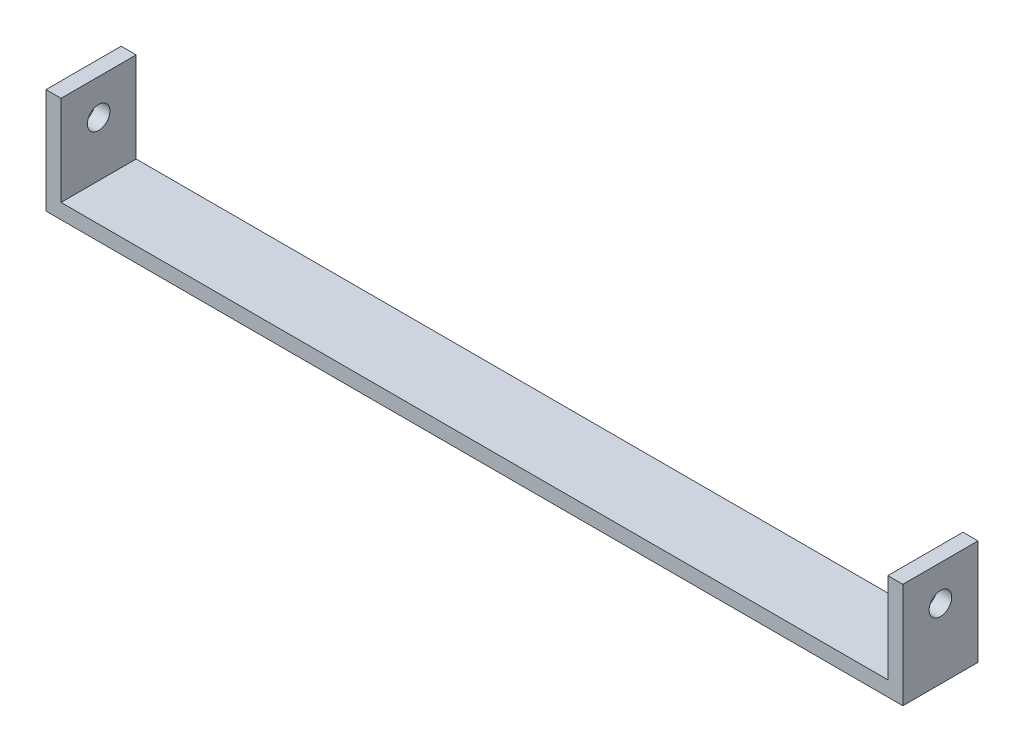
ISO-10303-21;
HEADER;
FILE_DESCRIPTION(('STEP AP214'),'2;1');
FILE_NAME('part.step','',(''),(''),'','','');
FILE_SCHEMA(('AUTOMOTIVE_DESIGN { 1 0 10303 214 1 1 1 1 }'));
ENDSEC;
DATA;
#1=APPLICATION_CONTEXT('core data for automotive mechanical design processes');
#2=APPLICATION_PROTOCOL_DEFINITION('international standard','automotive_design',2000,#1);
#3=PRODUCT_CONTEXT('',#1,'mechanical');
#4=PRODUCT('Part','Part','',(#3));
#5=PRODUCT_RELATED_PRODUCT_CATEGORY('part','',(#4));
#6=PRODUCT_DEFINITION_FORMATION('','',#4);
#7=PRODUCT_DEFINITION_CONTEXT('part definition',#1,'design');
#8=PRODUCT_DEFINITION('design','',#6,#7);
#9=PRODUCT_DEFINITION_SHAPE('','',#8);
#10=(LENGTH_UNIT() NAMED_UNIT(*) SI_UNIT(.MILLI.,.METRE.));
#11=(NAMED_UNIT(*) PLANE_ANGLE_UNIT() SI_UNIT($,.RADIAN.));
#12=(NAMED_UNIT(*) SI_UNIT($,.STERADIAN.) SOLID_ANGLE_UNIT());
#13=UNCERTAINTY_MEASURE_WITH_UNIT(LENGTH_MEASURE(1.E-05),#10,'distance_accuracy_value','');
#14=(GEOMETRIC_REPRESENTATION_CONTEXT(3) GLOBAL_UNCERTAINTY_ASSIGNED_CONTEXT((#13)) GLOBAL_UNIT_ASSIGNED_CONTEXT((#10,
#11,#12)) REPRESENTATION_CONTEXT('',''));
#15=CARTESIAN_POINT('',(0.,0.,0.));
#16=DIRECTION('',(0.,0.,1.));
#17=DIRECTION('',(1.,0.,0.));
#18=AXIS2_PLACEMENT_3D('',#15,#16,#17);
#19=CARTESIAN_POINT('',(-57.,0.,10.));
#20=DIRECTION('',(1.,0.,0.));
#21=DIRECTION('',(0.,1.,0.));
#22=AXIS2_PLACEMENT_3D('',#19,#20,#21);
#23=PLANE('',#22);
#24=CARTESIAN_POINT('',(-57.,9.28489764823584,5.));
#25=DIRECTION('',(1.,0.,0.));
#26=DIRECTION('',(0.,1.,0.));
#27=AXIS2_PLACEMENT_3D('',#24,#25,#26);
#28=CIRCLE('',#27,1.5);
#29=CARTESIAN_POINT('',(-57.,9.28489764823584,6.5));
#30=VERTEX_POINT('',#29);
#31=EDGE_CURVE('E134',#30,#30,#28,.T.);
#32=ORIENTED_EDGE('',*,*,#31,.T.);
#33=EDGE_LOOP('',(#32));
#34=FACE_BOUND('',#33,.T.);
#35=DIRECTION('',(0.,-1.,0.));
#36=VECTOR('',#35,1.);
#37=CARTESIAN_POINT('',(-57.,0.,0.));
#38=LINE('',#37,#36);
#39=CARTESIAN_POINT('',(-57.,13.9999999999999,0.));
#40=VERTEX_POINT('',#39);
#41=CARTESIAN_POINT('',(-57.,0.,0.));
#42=VERTEX_POINT('',#41);
#43=EDGE_CURVE('E130',#40,#42,#38,.T.);
#44=ORIENTED_EDGE('',*,*,#43,.T.);
#45=DIRECTION('',(0.,0.,-1.));
#46=VECTOR('',#45,1.);
#47=CARTESIAN_POINT('',(-57.,0.,10.));
#48=LINE('',#47,#46);
#49=CARTESIAN_POINT('',(-57.,0.,10.));
#50=VERTEX_POINT('',#49);
#51=EDGE_CURVE('E11',#50,#42,#48,.T.);
#52=ORIENTED_EDGE('',*,*,#51,.F.);
#53=DIRECTION('',(0.,-1.,0.));
#54=VECTOR('',#53,1.);
#55=CARTESIAN_POINT('',(-57.,0.,10.));
#56=LINE('',#55,#54);
#57=CARTESIAN_POINT('',(-57.,13.9999999999999,10.));
#58=VERTEX_POINT('',#57);
#59=EDGE_CURVE('E145',#58,#50,#56,.T.);
#60=ORIENTED_EDGE('',*,*,#59,.F.);
#61=DIRECTION('',(0.,0.,-1.));
#62=VECTOR('',#61,1.);
#63=CARTESIAN_POINT('',(-57.,13.9999999999999,10.));
#64=LINE('',#63,#62);
#65=EDGE_CURVE('E126',#58,#40,#64,.T.);
#66=ORIENTED_EDGE('',*,*,#65,.T.);
#67=EDGE_LOOP('',(#44,#52,#60,#66));
#68=FACE_BOUND('',#67,.T.);
#69=ADVANCED_FACE('F33',(#34,#68),#23,.F.);
#70=CARTESIAN_POINT('',(57.,0.,10.));
#71=DIRECTION('',(0.,1.,0.));
#72=DIRECTION('',(0.,0.,1.));
#73=AXIS2_PLACEMENT_3D('',#70,#71,#72);
#74=PLANE('',#73);
#75=DIRECTION('',(1.,0.,0.));
#76=VECTOR('',#75,1.);
#77=CARTESIAN_POINT('',(57.,0.,0.));
#78=LINE('',#77,#76);
#79=CARTESIAN_POINT('',(57.,0.,0.));
#80=VERTEX_POINT('',#79);
#81=EDGE_CURVE('E133',#42,#80,#78,.T.);
#82=ORIENTED_EDGE('',*,*,#81,.T.);
#83=DIRECTION('',(0.,0.,-1.));
#84=VECTOR('',#83,1.);
#85=CARTESIAN_POINT('',(57.,0.,10.));
#86=LINE('',#85,#84);
#87=CARTESIAN_POINT('',(57.,0.,10.));
#88=VERTEX_POINT('',#87);
#89=EDGE_CURVE('E42',#88,#80,#86,.T.);
#90=ORIENTED_EDGE('',*,*,#89,.F.);
#91=DIRECTION('',(1.,0.,0.));
#92=VECTOR('',#91,1.);
#93=CARTESIAN_POINT('',(57.,0.,10.));
#94=LINE('',#93,#92);
#95=EDGE_CURVE('E93',#50,#88,#94,.T.);
#96=ORIENTED_EDGE('',*,*,#95,.F.);
#97=ORIENTED_EDGE('',*,*,#51,.T.);
#98=EDGE_LOOP('',(#82,#90,#96,#97));
#99=FACE_BOUND('',#98,.T.);
#100=ADVANCED_FACE('F201',(#99),#74,.F.);
#101=CARTESIAN_POINT('',(57.,0.,10.));
#102=DIRECTION('',(-1.,0.,0.));
#103=DIRECTION('',(0.,-1.,0.));
#104=AXIS2_PLACEMENT_3D('',#101,#102,#103);
#105=PLANE('',#104);
#106=CARTESIAN_POINT('',(57.,9.28489764823584,5.));
#107=DIRECTION('',(-1.,0.,0.));
#108=DIRECTION('',(0.,0.,1.));
#109=AXIS2_PLACEMENT_3D('',#106,#107,#108);
#110=CIRCLE('',#109,1.5);
#111=CARTESIAN_POINT('',(57.,9.28489764823584,6.5));
#112=VERTEX_POINT('',#111);
#113=EDGE_CURVE('E184',#112,#112,#110,.T.);
#114=ORIENTED_EDGE('',*,*,#113,.T.);
#115=EDGE_LOOP('',(#114));
#116=FACE_BOUND('',#115,.T.);
#117=DIRECTION('',(0.,1.,0.));
#118=VECTOR('',#117,1.);
#119=CARTESIAN_POINT('',(57.,0.,0.));
#120=LINE('',#119,#118);
#121=CARTESIAN_POINT('',(57.,13.9999999999999,0.));
#122=VERTEX_POINT('',#121);
#123=EDGE_CURVE('E136',#80,#122,#120,.T.);
#124=ORIENTED_EDGE('',*,*,#123,.T.);
#125=DIRECTION('',(0.,0.,-1.));
#126=VECTOR('',#125,1.);
#127=CARTESIAN_POINT('',(57.,13.9999999999999,10.));
#128=LINE('',#127,#126);
#129=CARTESIAN_POINT('',(57.,13.9999999999999,10.));
#130=VERTEX_POINT('',#129);
#131=EDGE_CURVE('E152',#130,#122,#128,.T.);
#132=ORIENTED_EDGE('',*,*,#131,.F.);
#133=DIRECTION('',(0.,1.,0.));
#134=VECTOR('',#133,1.);
#135=CARTESIAN_POINT('',(57.,0.,10.));
#136=LINE('',#135,#134);
#137=EDGE_CURVE('E161',#88,#130,#136,.T.);
#138=ORIENTED_EDGE('',*,*,#137,.F.);
#139=ORIENTED_EDGE('',*,*,#89,.T.);
#140=EDGE_LOOP('',(#124,#132,#138,#139));
#141=FACE_BOUND('',#140,.T.);
#142=ADVANCED_FACE('F159',(#116,#141),#105,.F.);
#143=CARTESIAN_POINT('',(57.,13.9999999999999,10.));
#144=DIRECTION('',(0.,-1.,0.));
#145=DIRECTION('',(1.,0.,0.));
#146=AXIS2_PLACEMENT_3D('',#143,#144,#145);
#147=PLANE('',#146);
#148=DIRECTION('',(-1.,0.,0.));
#149=VECTOR('',#148,1.);
#150=CARTESIAN_POINT('',(57.,13.9999999999999,0.));
#151=LINE('',#150,#149);
#152=CARTESIAN_POINT('',(55.,13.9999999999999,0.));
#153=VERTEX_POINT('',#152);
#154=EDGE_CURVE('E138',#122,#153,#151,.T.);
#155=ORIENTED_EDGE('',*,*,#154,.T.);
#156=DIRECTION('',(0.,0.,-1.));
#157=VECTOR('',#156,1.);
#158=CARTESIAN_POINT('',(55.,13.9999999999999,10.));
#159=LINE('',#158,#157);
#160=CARTESIAN_POINT('',(55.,13.9999999999999,10.));
#161=VERTEX_POINT('',#160);
#162=EDGE_CURVE('E149',#161,#153,#159,.T.);
#163=ORIENTED_EDGE('',*,*,#162,.F.);
#164=DIRECTION('',(-1.,0.,0.));
#165=VECTOR('',#164,1.);
#166=CARTESIAN_POINT('',(57.,13.9999999999999,10.));
#167=LINE('',#166,#165);
#168=EDGE_CURVE('E173',#130,#161,#167,.T.);
#169=ORIENTED_EDGE('',*,*,#168,.F.);
#170=ORIENTED_EDGE('',*,*,#131,.T.);
#171=EDGE_LOOP('',(#155,#163,#169,#170));
#172=FACE_BOUND('',#171,.T.);
#173=ADVANCED_FACE('F169',(#172),#147,.F.);
#174=CARTESIAN_POINT('',(55.,13.9999999999999,10.));
#175=DIRECTION('',(1.,0.,0.));
#176=DIRECTION('',(0.,0.,-1.));
#177=AXIS2_PLACEMENT_3D('',#174,#175,#176);
#178=PLANE('',#177);
#179=CARTESIAN_POINT('',(55.,9.28489764823584,5.));
#180=DIRECTION('',(1.,0.,0.));
#181=DIRECTION('',(0.,0.,-1.));
#182=AXIS2_PLACEMENT_3D('',#179,#180,#181);
#183=CIRCLE('',#182,1.5);
#184=CARTESIAN_POINT('',(55.,9.28489764823584,6.5));
#185=VERTEX_POINT('',#184);
#186=EDGE_CURVE('E181',#185,#185,#183,.T.);
#187=ORIENTED_EDGE('',*,*,#186,.T.);
#188=EDGE_LOOP('',(#187));
#189=FACE_BOUND('',#188,.T.);
#190=DIRECTION('',(0.,-1.,0.));
#191=VECTOR('',#190,1.);
#192=CARTESIAN_POINT('',(55.,13.9999999999999,0.));
#193=LINE('',#192,#191);
#194=CARTESIAN_POINT('',(55.,1.99999999999998,0.));
#195=VERTEX_POINT('',#194);
#196=EDGE_CURVE('E140',#153,#195,#193,.T.);
#197=ORIENTED_EDGE('',*,*,#196,.T.);
#198=DIRECTION('',(0.,0.,-1.));
#199=VECTOR('',#198,1.);
#200=CARTESIAN_POINT('',(55.,1.99999999999998,10.));
#201=LINE('',#200,#199);
#202=CARTESIAN_POINT('',(55.,1.99999999999998,10.));
#203=VERTEX_POINT('',#202);
#204=EDGE_CURVE('E121',#203,#195,#201,.T.);
#205=ORIENTED_EDGE('',*,*,#204,.F.);
#206=DIRECTION('',(0.,-1.,0.));
#207=VECTOR('',#206,1.);
#208=CARTESIAN_POINT('',(55.,13.9999999999999,10.));
#209=LINE('',#208,#207);
#210=EDGE_CURVE('E112',#161,#203,#209,.T.);
#211=ORIENTED_EDGE('',*,*,#210,.F.);
#212=ORIENTED_EDGE('',*,*,#162,.T.);
#213=EDGE_LOOP('',(#197,#205,#211,#212));
#214=FACE_BOUND('',#213,.T.);
#215=ADVANCED_FACE('F172',(#189,#214),#178,.F.);
#216=CARTESIAN_POINT('',(-55.,1.99999999999998,10.));
#217=DIRECTION('',(0.,-1.,0.));
#218=DIRECTION('',(0.,0.,-1.));
#219=AXIS2_PLACEMENT_3D('',#216,#217,#218);
#220=PLANE('',#219);
#221=DIRECTION('',(-1.,0.,0.));
#222=VECTOR('',#221,1.);
#223=CARTESIAN_POINT('',(-55.,1.99999999999998,0.));
#224=LINE('',#223,#222);
#225=CARTESIAN_POINT('',(-55.,1.99999999999998,0.));
#226=VERTEX_POINT('',#225);
#227=EDGE_CURVE('E120',#195,#226,#224,.T.);
#228=ORIENTED_EDGE('',*,*,#227,.T.);
#229=DIRECTION('',(0.,0.,-1.));
#230=VECTOR('',#229,1.);
#231=CARTESIAN_POINT('',(-55.,1.99999999999998,10.));
#232=LINE('',#231,#230);
#233=CARTESIAN_POINT('',(-55.,1.99999999999998,10.));
#234=VERTEX_POINT('',#233);
#235=EDGE_CURVE('E117',#234,#226,#232,.T.);
#236=ORIENTED_EDGE('',*,*,#235,.F.);
#237=DIRECTION('',(-1.,0.,0.));
#238=VECTOR('',#237,1.);
#239=CARTESIAN_POINT('',(-55.,1.99999999999998,10.));
#240=LINE('',#239,#238);
#241=EDGE_CURVE('E106',#203,#234,#240,.T.);
#242=ORIENTED_EDGE('',*,*,#241,.F.);
#243=ORIENTED_EDGE('',*,*,#204,.T.);
#244=EDGE_LOOP('',(#228,#236,#242,#243));
#245=FACE_BOUND('',#244,.T.);
#246=ADVANCED_FACE('F118',(#245),#220,.F.);
#247=CARTESIAN_POINT('',(-55.,13.9999999999999,10.));
#248=DIRECTION('',(-1.,0.,0.));
#249=DIRECTION('',(0.,0.,1.));
#250=AXIS2_PLACEMENT_3D('',#247,#248,#249);
#251=PLANE('',#250);
#252=CARTESIAN_POINT('',(-55.,9.28489764823584,5.));
#253=DIRECTION('',(-1.,0.,0.));
#254=DIRECTION('',(0.,0.,1.));
#255=AXIS2_PLACEMENT_3D('',#252,#253,#254);
#256=CIRCLE('',#255,1.5);
#257=CARTESIAN_POINT('',(-55.,9.28489764823584,6.5));
#258=VERTEX_POINT('',#257);
#259=EDGE_CURVE('E36',#258,#258,#256,.T.);
#260=ORIENTED_EDGE('',*,*,#259,.T.);
#261=EDGE_LOOP('',(#260));
#262=FACE_BOUND('',#261,.T.);
#263=DIRECTION('',(0.,1.,0.));
#264=VECTOR('',#263,1.);
#265=CARTESIAN_POINT('',(-55.,13.9999999999999,0.));
#266=LINE('',#265,#264);
#267=CARTESIAN_POINT('',(-55.,13.9999999999999,0.));
#268=VERTEX_POINT('',#267);
#269=EDGE_CURVE('E79',#226,#268,#266,.T.);
#270=ORIENTED_EDGE('',*,*,#269,.T.);
#271=DIRECTION('',(0.,0.,-1.));
#272=VECTOR('',#271,1.);
#273=CARTESIAN_POINT('',(-55.,13.9999999999999,10.));
#274=LINE('',#273,#272);
#275=CARTESIAN_POINT('',(-55.,13.9999999999999,10.));
#276=VERTEX_POINT('',#275);
#277=EDGE_CURVE('E122',#276,#268,#274,.T.);
#278=ORIENTED_EDGE('',*,*,#277,.F.);
#279=DIRECTION('',(0.,1.,0.));
#280=VECTOR('',#279,1.);
#281=CARTESIAN_POINT('',(-55.,13.9999999999999,10.));
#282=LINE('',#281,#280);
#283=EDGE_CURVE('E110',#234,#276,#282,.T.);
#284=ORIENTED_EDGE('',*,*,#283,.F.);
#285=ORIENTED_EDGE('',*,*,#235,.T.);
#286=EDGE_LOOP('',(#270,#278,#284,#285));
#287=FACE_BOUND('',#286,.T.);
#288=ADVANCED_FACE('F124',(#262,#287),#251,.F.);
#289=CARTESIAN_POINT('',(-57.,13.9999999999999,10.));
#290=DIRECTION('',(0.,-1.,0.));
#291=DIRECTION('',(1.,0.,0.));
#292=AXIS2_PLACEMENT_3D('',#289,#290,#291);
#293=PLANE('',#292);
#294=DIRECTION('',(-1.,0.,0.));
#295=VECTOR('',#294,1.);
#296=CARTESIAN_POINT('',(-57.,13.9999999999999,0.));
#297=LINE('',#296,#295);
#298=EDGE_CURVE('E85',#268,#40,#297,.T.);
#299=ORIENTED_EDGE('',*,*,#298,.T.);
#300=ORIENTED_EDGE('',*,*,#65,.F.);
#301=DIRECTION('',(-1.,0.,0.));
#302=VECTOR('',#301,1.);
#303=CARTESIAN_POINT('',(-57.,13.9999999999999,10.));
#304=LINE('',#303,#302);
#305=EDGE_CURVE('E50',#276,#58,#304,.T.);
#306=ORIENTED_EDGE('',*,*,#305,.F.);
#307=ORIENTED_EDGE('',*,*,#277,.T.);
#308=EDGE_LOOP('',(#299,#300,#306,#307));
#309=FACE_BOUND('',#308,.T.);
#310=ADVANCED_FACE('F204',(#309),#293,.F.);
#311=CARTESIAN_POINT('',(0.,0.,10.));
#312=DIRECTION('',(0.,0.,-1.));
#313=DIRECTION('',(-1.,0.,0.));
#314=AXIS2_PLACEMENT_3D('',#311,#312,#313);
#315=PLANE('',#314);
#316=ORIENTED_EDGE('',*,*,#59,.T.);
#317=ORIENTED_EDGE('',*,*,#95,.T.);
#318=ORIENTED_EDGE('',*,*,#137,.T.);
#319=ORIENTED_EDGE('',*,*,#168,.T.);
#320=ORIENTED_EDGE('',*,*,#210,.T.);
#321=ORIENTED_EDGE('',*,*,#241,.T.);
#322=ORIENTED_EDGE('',*,*,#283,.T.);
#323=ORIENTED_EDGE('',*,*,#305,.T.);
#324=EDGE_LOOP('',(#316,#317,#318,#319,#320,#321,#322,#323));
#325=FACE_BOUND('',#324,.T.);
#326=ADVANCED_FACE('F108',(#325),#315,.F.);
#327=CARTESIAN_POINT('',(0.,0.,0.));
#328=DIRECTION('',(0.,0.,-1.));
#329=DIRECTION('',(-1.,0.,0.));
#330=AXIS2_PLACEMENT_3D('',#327,#328,#329);
#331=PLANE('',#330);
#332=ORIENTED_EDGE('',*,*,#43,.F.);
#333=ORIENTED_EDGE('',*,*,#298,.F.);
#334=ORIENTED_EDGE('',*,*,#269,.F.);
#335=ORIENTED_EDGE('',*,*,#227,.F.);
#336=ORIENTED_EDGE('',*,*,#196,.F.);
#337=ORIENTED_EDGE('',*,*,#154,.F.);
#338=ORIENTED_EDGE('',*,*,#123,.F.);
#339=ORIENTED_EDGE('',*,*,#81,.F.);
#340=EDGE_LOOP('',(#332,#333,#334,#335,#336,#337,#338,#339));
#341=FACE_BOUND('',#340,.T.);
#342=ADVANCED_FACE('F165',(#341),#331,.T.);
#343=CARTESIAN_POINT('',(57.,9.28489764823584,5.));
#344=DIRECTION('',(-1.,0.,0.));
#345=DIRECTION('',(0.,0.,1.));
#346=AXIS2_PLACEMENT_3D('',#343,#344,#345);
#347=CYLINDRICAL_SURFACE('',#346,1.5);
#348=CARTESIAN_POINT('',(-55.,9.28489764823584,6.5));
#349=CARTESIAN_POINT('',(-55.0208333333333,9.28489764823584,6.5));
#350=CARTESIAN_POINT('',(-55.0416666666666,9.28489764823584,6.5));
#351=CARTESIAN_POINT('',(-55.0833333333333,9.28489764823584,6.5));
#352=CARTESIAN_POINT('',(-55.1041666666666,9.28489764823584,6.5));
#353=CARTESIAN_POINT('',(-55.1458333333333,9.28489764823584,6.5));
#354=CARTESIAN_POINT('',(-55.1666666666666,9.28489764823584,6.5));
#355=CARTESIAN_POINT('',(-55.2083333333333,9.28489764823584,6.5));
#356=CARTESIAN_POINT('',(-55.2291666666666,9.28489764823584,6.5));
#357=CARTESIAN_POINT('',(-55.2708333333333,9.28489764823584,6.5));
#358=CARTESIAN_POINT('',(-55.2916666666666,9.28489764823584,6.5));
#359=CARTESIAN_POINT('',(-55.3333333333333,9.28489764823584,6.5));
#360=CARTESIAN_POINT('',(-55.3541666666666,9.28489764823584,6.5));
#361=CARTESIAN_POINT('',(-55.3958333333333,9.28489764823584,6.5));
#362=CARTESIAN_POINT('',(-55.4166666666666,9.28489764823584,6.5));
#363=CARTESIAN_POINT('',(-55.4583333333333,9.28489764823584,6.5));
#364=CARTESIAN_POINT('',(-55.4791666666666,9.28489764823584,6.5));
#365=CARTESIAN_POINT('',(-55.5208333333333,9.28489764823584,6.5));
#366=CARTESIAN_POINT('',(-55.5416666666666,9.28489764823584,6.5));
#367=CARTESIAN_POINT('',(-55.5833333333333,9.28489764823584,6.5));
#368=CARTESIAN_POINT('',(-55.6041666666667,9.28489764823584,6.5));
#369=CARTESIAN_POINT('',(-55.6458333333333,9.28489764823584,6.5));
#370=CARTESIAN_POINT('',(-55.6666666666667,9.28489764823584,6.5));
#371=CARTESIAN_POINT('',(-55.7083333333333,9.28489764823584,6.5));
#372=CARTESIAN_POINT('',(-55.7291666666667,9.28489764823584,6.5));
#373=CARTESIAN_POINT('',(-55.7708333333333,9.28489764823584,6.5));
#374=CARTESIAN_POINT('',(-55.7916666666667,9.28489764823584,6.5));
#375=CARTESIAN_POINT('',(-55.8333333333333,9.28489764823584,6.5));
#376=CARTESIAN_POINT('',(-55.8541666666667,9.28489764823584,6.5));
#377=CARTESIAN_POINT('',(-55.8958333333333,9.28489764823584,6.5));
#378=CARTESIAN_POINT('',(-55.9166666666667,9.28489764823584,6.5));
#379=CARTESIAN_POINT('',(-55.9583333333333,9.28489764823584,6.5));
#380=CARTESIAN_POINT('',(-55.9791666666667,9.28489764823584,6.5));
#381=CARTESIAN_POINT('',(-56.0208333333333,9.28489764823584,6.5));
#382=CARTESIAN_POINT('',(-56.0416666666667,9.28489764823584,6.5));
#383=CARTESIAN_POINT('',(-56.0833333333333,9.28489764823584,6.5));
#384=CARTESIAN_POINT('',(-56.1041666666667,9.28489764823584,6.5));
#385=CARTESIAN_POINT('',(-56.1458333333333,9.28489764823584,6.5));
#386=CARTESIAN_POINT('',(-56.1666666666667,9.28489764823584,6.5));
#387=CARTESIAN_POINT('',(-56.2083333333333,9.28489764823584,6.5));
#388=CARTESIAN_POINT('',(-56.2291666666667,9.28489764823584,6.5));
#389=CARTESIAN_POINT('',(-56.2708333333333,9.28489764823584,6.5));
#390=CARTESIAN_POINT('',(-56.2916666666667,9.28489764823584,6.5));
#391=CARTESIAN_POINT('',(-56.3333333333333,9.28489764823584,6.5));
#392=CARTESIAN_POINT('',(-56.3541666666667,9.28489764823584,6.5));
#393=CARTESIAN_POINT('',(-56.3958333333333,9.28489764823584,6.5));
#394=CARTESIAN_POINT('',(-56.4166666666667,9.28489764823584,6.5));
#395=CARTESIAN_POINT('',(-56.4583333333333,9.28489764823584,6.5));
#396=CARTESIAN_POINT('',(-56.4791666666667,9.28489764823584,6.5));
#397=CARTESIAN_POINT('',(-56.5208333333333,9.28489764823584,6.5));
#398=CARTESIAN_POINT('',(-56.5416666666667,9.28489764823584,6.5));
#399=CARTESIAN_POINT('',(-56.5833333333333,9.28489764823584,6.5));
#400=CARTESIAN_POINT('',(-56.6041666666667,9.28489764823584,6.5));
#401=CARTESIAN_POINT('',(-56.6458333333333,9.28489764823584,6.5));
#402=CARTESIAN_POINT('',(-56.6666666666667,9.28489764823584,6.5));
#403=CARTESIAN_POINT('',(-56.7083333333333,9.28489764823584,6.5));
#404=CARTESIAN_POINT('',(-56.7291666666667,9.28489764823584,6.5));
#405=CARTESIAN_POINT('',(-56.7708333333333,9.28489764823584,6.5));
#406=CARTESIAN_POINT('',(-56.7916666666667,9.28489764823584,6.5));
#407=CARTESIAN_POINT('',(-56.8333333333333,9.28489764823584,6.5));
#408=CARTESIAN_POINT('',(-56.8541666666667,9.28489764823584,6.5));
#409=CARTESIAN_POINT('',(-56.8958333333333,9.28489764823584,6.5));
#410=CARTESIAN_POINT('',(-56.9166666666667,9.28489764823584,6.5));
#411=CARTESIAN_POINT('',(-56.9583333333333,9.28489764823584,6.5));
#412=CARTESIAN_POINT('',(-56.9791666666667,9.28489764823584,6.5));
#413=CARTESIAN_POINT('',(-57.,9.28489764823584,6.5));
#414=B_SPLINE_CURVE_WITH_KNOTS('',3,(#348,#349,#350,#351,#352,#353,#354,#355,#356,#357,#358,
#359,#360,#361,#362,#363,#364,#365,#366,#367,#368,#369,#370,#371,#372,#373,#374,#375,#376,#377,
#378,#379,#380,#381,#382,#383,#384,#385,#386,#387,#388,#389,#390,#391,#392,#393,#394,#395,#396,
#397,#398,#399,#400,#401,#402,#403,#404,#405,#406,#407,#408,#409,#410,#411,#412,#413),
.UNSPECIFIED.,.F.,.F.,(4,2,2,2,2,2,2,2,2,2,2,2,2,2,2,2,2,2,2,2,2,2,2,2,2,2,2,2,2,2,2,2,4),(0.,
0.062500000000007,0.125,0.187500000000007,0.25,0.312500000000007,0.375,0.437500000000007,0.5,
0.562500000000007,0.625000000000014,0.687500000000008,0.750000000000015,0.812500000000008,
0.875000000000015,0.937500000000008,1.00000000000001,1.06250000000002,1.12500000000001,
1.18750000000002,1.25000000000002,1.31250000000002,1.37500000000002,1.43750000000002,
1.50000000000003,1.56250000000002,1.62500000000003,1.68750000000002,1.75000000000003,
1.81250000000002,1.87500000000003,1.93750000000002,2.00000000000003),.UNSPECIFIED.);
#415=EDGE_CURVE('BSEAM192',#258,#30,#414,.T.);
#416=ORIENTED_EDGE('',*,*,#259,.F.);
#417=ORIENTED_EDGE('',*,*,#31,.F.);
#418=ORIENTED_EDGE('',*,*,#415,.T.);
#419=ORIENTED_EDGE('',*,*,#415,.F.);
#420=EDGE_LOOP('',(#416,#418,#417,#419));
#421=FACE_BOUND('',#420,.T.);
#422=ADVANCED_FACE('F192',(#421),#347,.F.);
#423=CARTESIAN_POINT('',(57.,9.28489764823584,6.5));
#424=CARTESIAN_POINT('',(56.9791666666667,9.28489764823584,6.5));
#425=CARTESIAN_POINT('',(56.9583333333333,9.28489764823584,6.5));
#426=CARTESIAN_POINT('',(56.9166666666667,9.28489764823584,6.5));
#427=CARTESIAN_POINT('',(56.8958333333333,9.28489764823584,6.5));
#428=CARTESIAN_POINT('',(56.8541666666667,9.28489764823584,6.5));
#429=CARTESIAN_POINT('',(56.8333333333333,9.28489764823584,6.5));
#430=CARTESIAN_POINT('',(56.7916666666667,9.28489764823584,6.5));
#431=CARTESIAN_POINT('',(56.7708333333333,9.28489764823584,6.5));
#432=CARTESIAN_POINT('',(56.7291666666667,9.28489764823584,6.5));
#433=CARTESIAN_POINT('',(56.7083333333333,9.28489764823584,6.5));
#434=CARTESIAN_POINT('',(56.6666666666667,9.28489764823584,6.5));
#435=CARTESIAN_POINT('',(56.6458333333333,9.28489764823584,6.5));
#436=CARTESIAN_POINT('',(56.6041666666667,9.28489764823584,6.5));
#437=CARTESIAN_POINT('',(56.5833333333333,9.28489764823584,6.5));
#438=CARTESIAN_POINT('',(56.5416666666667,9.28489764823584,6.5));
#439=CARTESIAN_POINT('',(56.5208333333333,9.28489764823584,6.5));
#440=CARTESIAN_POINT('',(56.4791666666667,9.28489764823584,6.5));
#441=CARTESIAN_POINT('',(56.4583333333333,9.28489764823584,6.5));
#442=CARTESIAN_POINT('',(56.4166666666667,9.28489764823584,6.5));
#443=CARTESIAN_POINT('',(56.3958333333333,9.28489764823584,6.5));
#444=CARTESIAN_POINT('',(56.3541666666667,9.28489764823584,6.5));
#445=CARTESIAN_POINT('',(56.3333333333333,9.28489764823584,6.5));
#446=CARTESIAN_POINT('',(56.2916666666667,9.28489764823584,6.5));
#447=CARTESIAN_POINT('',(56.2708333333333,9.28489764823584,6.5));
#448=CARTESIAN_POINT('',(56.2291666666667,9.28489764823584,6.5));
#449=CARTESIAN_POINT('',(56.2083333333333,9.28489764823584,6.5));
#450=CARTESIAN_POINT('',(56.1666666666667,9.28489764823584,6.5));
#451=CARTESIAN_POINT('',(56.1458333333333,9.28489764823584,6.5));
#452=CARTESIAN_POINT('',(56.1041666666667,9.28489764823584,6.5));
#453=CARTESIAN_POINT('',(56.0833333333333,9.28489764823584,6.5));
#454=CARTESIAN_POINT('',(56.0416666666667,9.28489764823584,6.5));
#455=CARTESIAN_POINT('',(56.0208333333333,9.28489764823584,6.5));
#456=CARTESIAN_POINT('',(55.9791666666667,9.28489764823584,6.5));
#457=CARTESIAN_POINT('',(55.9583333333333,9.28489764823584,6.5));
#458=CARTESIAN_POINT('',(55.9166666666667,9.28489764823584,6.5));
#459=CARTESIAN_POINT('',(55.8958333333333,9.28489764823584,6.5));
#460=CARTESIAN_POINT('',(55.8541666666667,9.28489764823584,6.5));
#461=CARTESIAN_POINT('',(55.8333333333333,9.28489764823584,6.5));
#462=CARTESIAN_POINT('',(55.7916666666667,9.28489764823584,6.5));
#463=CARTESIAN_POINT('',(55.7708333333333,9.28489764823584,6.5));
#464=CARTESIAN_POINT('',(55.7291666666667,9.28489764823584,6.5));
#465=CARTESIAN_POINT('',(55.7083333333333,9.28489764823584,6.5));
#466=CARTESIAN_POINT('',(55.6666666666667,9.28489764823584,6.5));
#467=CARTESIAN_POINT('',(55.6458333333333,9.28489764823584,6.5));
#468=CARTESIAN_POINT('',(55.6041666666667,9.28489764823584,6.5));
#469=CARTESIAN_POINT('',(55.5833333333333,9.28489764823584,6.5));
#470=CARTESIAN_POINT('',(55.5416666666667,9.28489764823584,6.5));
#471=CARTESIAN_POINT('',(55.5208333333333,9.28489764823584,6.5));
#472=CARTESIAN_POINT('',(55.4791666666667,9.28489764823584,6.5));
#473=CARTESIAN_POINT('',(55.4583333333333,9.28489764823584,6.5));
#474=CARTESIAN_POINT('',(55.4166666666667,9.28489764823584,6.5));
#475=CARTESIAN_POINT('',(55.3958333333333,9.28489764823584,6.5));
#476=CARTESIAN_POINT('',(55.3541666666667,9.28489764823584,6.5));
#477=CARTESIAN_POINT('',(55.3333333333333,9.28489764823584,6.5));
#478=CARTESIAN_POINT('',(55.2916666666667,9.28489764823584,6.5));
#479=CARTESIAN_POINT('',(55.2708333333333,9.28489764823584,6.5));
#480=CARTESIAN_POINT('',(55.2291666666667,9.28489764823584,6.5));
#481=CARTESIAN_POINT('',(55.2083333333333,9.28489764823584,6.5));
#482=CARTESIAN_POINT('',(55.1666666666667,9.28489764823584,6.5));
#483=CARTESIAN_POINT('',(55.1458333333333,9.28489764823584,6.5));
#484=CARTESIAN_POINT('',(55.1041666666667,9.28489764823584,6.5));
#485=CARTESIAN_POINT('',(55.0833333333333,9.28489764823584,6.5));
#486=CARTESIAN_POINT('',(55.0416666666667,9.28489764823584,6.5));
#487=CARTESIAN_POINT('',(55.0208333333333,9.28489764823584,6.5));
#488=CARTESIAN_POINT('',(55.,9.28489764823584,6.5));
#489=B_SPLINE_CURVE_WITH_KNOTS('',3,(#423,#424,#425,#426,#427,#428,#429,#430,#431,#432,#433,
#434,#435,#436,#437,#438,#439,#440,#441,#442,#443,#444,#445,#446,#447,#448,#449,#450,#451,#452,
#453,#454,#455,#456,#457,#458,#459,#460,#461,#462,#463,#464,#465,#466,#467,#468,#469,#470,#471,
#472,#473,#474,#475,#476,#477,#478,#479,#480,#481,#482,#483,#484,#485,#486,#487,#488),
.UNSPECIFIED.,.F.,.F.,(4,2,2,2,2,2,2,2,2,2,2,2,2,2,2,2,2,2,2,2,2,2,2,2,2,2,2,2,2,2,2,2,4),(0.,
0.062500000000007,0.125000000000007,0.187500000000007,0.250000000000007,0.312500000000007,
0.375000000000007,0.437500000000007,0.500000000000007,0.562500000000007,0.625000000000008,
0.687500000000008,0.750000000000008,0.812500000000008,0.875000000000008,0.937500000000008,
1.00000000000001,1.06250000000001,1.12500000000001,1.18750000000001,1.25000000000002,
1.31250000000002,1.37500000000002,1.43750000000002,1.50000000000002,1.56250000000002,
1.62500000000002,1.68750000000002,1.75000000000002,1.81250000000002,1.87500000000002,
1.93750000000002,2.00000000000002),.UNSPECIFIED.);
#490=EDGE_CURVE('BSEAM195',#112,#185,#489,.T.);
#491=ORIENTED_EDGE('',*,*,#113,.F.);
#492=ORIENTED_EDGE('',*,*,#186,.F.);
#493=ORIENTED_EDGE('',*,*,#490,.T.);
#494=ORIENTED_EDGE('',*,*,#490,.F.);
#495=EDGE_LOOP('',(#491,#493,#492,#494));
#496=FACE_BOUND('',#495,.T.);
#497=ADVANCED_FACE('F195',(#496),#347,.F.);
#498=CLOSED_SHELL('',(#69,#100,#142,#173,#215,#246,#288,#310,#326,#342,#422,#497));
#499=MANIFOLD_SOLID_BREP('B2',#498);
#500=ADVANCED_BREP_SHAPE_REPRESENTATION('',(#18,#499),#14);
#501=SHAPE_DEFINITION_REPRESENTATION(#9,#500);
ENDSEC;
END-ISO-10303-21;
